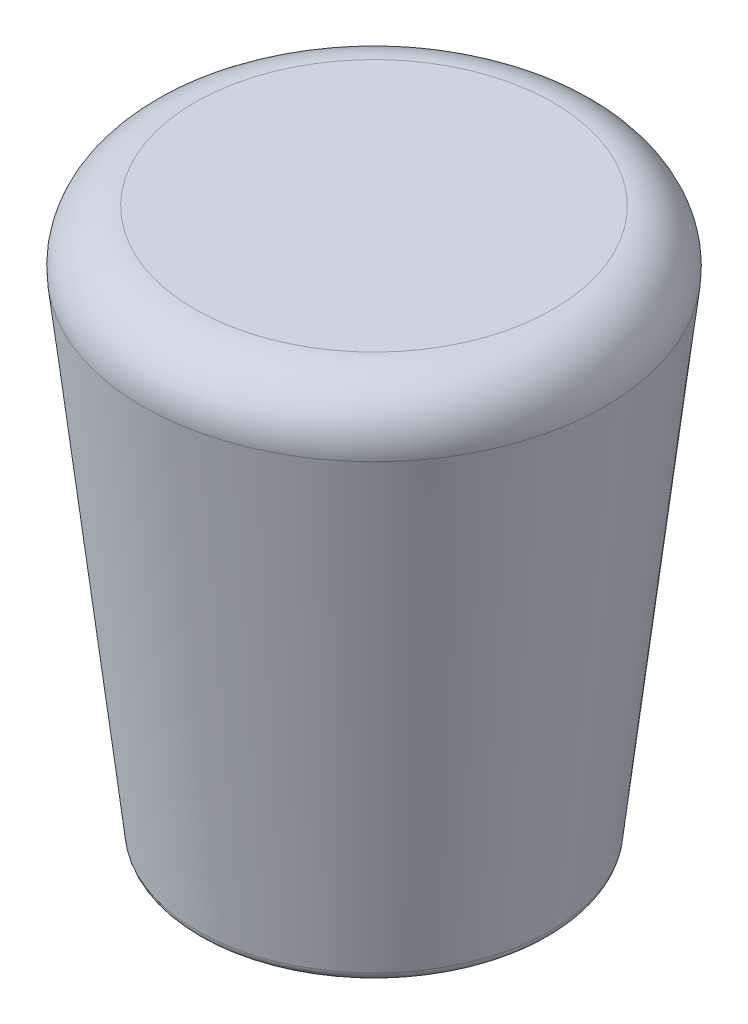
ISO-10303-21;
HEADER;
FILE_DESCRIPTION(('STEP AP214'),'2;1');
FILE_NAME('part.step','',(''),(''),'','','');
FILE_SCHEMA(('AUTOMOTIVE_DESIGN { 1 0 10303 214 1 1 1 1 }'));
ENDSEC;
DATA;
#1=APPLICATION_CONTEXT('core data for automotive mechanical design processes');
#2=APPLICATION_PROTOCOL_DEFINITION('international standard','automotive_design',2000,#1);
#3=PRODUCT_CONTEXT('',#1,'mechanical');
#4=PRODUCT('Part','Part','',(#3));
#5=PRODUCT_RELATED_PRODUCT_CATEGORY('part','',(#4));
#6=PRODUCT_DEFINITION_FORMATION('','',#4);
#7=PRODUCT_DEFINITION_CONTEXT('part definition',#1,'design');
#8=PRODUCT_DEFINITION('design','',#6,#7);
#9=PRODUCT_DEFINITION_SHAPE('','',#8);
#10=(LENGTH_UNIT() NAMED_UNIT(*) SI_UNIT(.MILLI.,.METRE.));
#11=(NAMED_UNIT(*) PLANE_ANGLE_UNIT() SI_UNIT($,.RADIAN.));
#12=(NAMED_UNIT(*) SI_UNIT($,.STERADIAN.) SOLID_ANGLE_UNIT());
#13=UNCERTAINTY_MEASURE_WITH_UNIT(LENGTH_MEASURE(1.E-05),#10,'distance_accuracy_value','');
#14=(GEOMETRIC_REPRESENTATION_CONTEXT(3) GLOBAL_UNCERTAINTY_ASSIGNED_CONTEXT((#13)) GLOBAL_UNIT_ASSIGNED_CONTEXT((#10,
#11,#12)) REPRESENTATION_CONTEXT('',''));
#15=CARTESIAN_POINT('',(0.,0.,0.));
#16=DIRECTION('',(0.,0.,1.));
#17=DIRECTION('',(1.,0.,0.));
#18=AXIS2_PLACEMENT_3D('',#15,#16,#17);
#19=CARTESIAN_POINT('',(0.,0.,0.));
#20=DIRECTION('',(0.,1.,0.));
#21=DIRECTION('',(0.,0.,1.));
#22=AXIS2_PLACEMENT_3D('',#19,#20,#21);
#23=CONICAL_SURFACE('',#22,3.35,0.113446401379632);
#24=CARTESIAN_POINT('',(0.,0.177359357246387,0.));
#25=DIRECTION('',(0.,-1.,0.));
#26=DIRECTION('',(0.,0.,-1.));
#27=AXIS2_PLACEMENT_3D('',#24,#25,#26);
#28=CIRCLE('',#27,3.37020754625586);
#29=CARTESIAN_POINT('',(0.,0.177359357246387,-3.37020754625586));
#30=VERTEX_POINT('',#29);
#31=EDGE_CURVE('E39',#30,#30,#28,.F.);
#32=ORIENTED_EDGE('',*,*,#31,.T.);
#33=EDGE_LOOP('',(#32));
#34=FACE_BOUND('',#33,.T.);
#35=CARTESIAN_POINT('',(0.,9.38679678623211,0.));
#36=DIRECTION('',(0.,1.,0.));
#37=DIRECTION('',(0.,0.,1.));
#38=AXIS2_PLACEMENT_3D('',#35,#36,#37);
#39=CIRCLE('',#38,4.41949040184329);
#40=CARTESIAN_POINT('',(0.,9.38679678623211,4.41949040184329));
#41=VERTEX_POINT('',#40);
#42=EDGE_CURVE('E43',#41,#41,#39,.F.);
#43=ORIENTED_EDGE('',*,*,#42,.T.);
#44=EDGE_LOOP('',(#43));
#45=FACE_BOUND('',#44,.T.);
#46=ADVANCED_FACE('F32',(#34,#45),#23,.T.);
#47=CARTESIAN_POINT('',(0.,10.5,0.));
#48=DIRECTION('',(0.,1.,0.));
#49=DIRECTION('',(0.,0.,1.));
#50=AXIS2_PLACEMENT_3D('',#47,#48,#49);
#51=PLANE('',#50);
#52=CARTESIAN_POINT('',(0.,10.5,0.));
#53=DIRECTION('',(0.,1.,0.));
#54=DIRECTION('',(0.,0.,1.));
#55=AXIS2_PLACEMENT_3D('',#52,#53,#54);
#56=CIRCLE('',#55,3.4259185461667);
#57=CARTESIAN_POINT('',(0.,10.5,3.4259185461667));
#58=VERTEX_POINT('',#57);
#59=EDGE_CURVE('E47',#58,#58,#56,.T.);
#60=ORIENTED_EDGE('',*,*,#59,.T.);
#61=EDGE_LOOP('',(#60));
#62=FACE_BOUND('',#61,.T.);
#63=ADVANCED_FACE('F69',(#62),#51,.T.);
#64=CARTESIAN_POINT('',(0.,0.,0.));
#65=DIRECTION('',(0.,1.,0.));
#66=DIRECTION('',(0.,0.,1.));
#67=AXIS2_PLACEMENT_3D('',#64,#65,#66);
#68=PLANE('',#67);
#69=CARTESIAN_POINT('',(0.,0.,0.));
#70=DIRECTION('',(0.,1.,0.));
#71=DIRECTION('',(0.,0.,1.));
#72=AXIS2_PLACEMENT_3D('',#69,#70,#71);
#73=CIRCLE('',#72,3.17149317512054);
#74=CARTESIAN_POINT('',(0.,0.,3.17149317512054));
#75=VERTEX_POINT('',#74);
#76=EDGE_CURVE('E10',#75,#75,#73,.F.);
#77=ORIENTED_EDGE('',*,*,#76,.T.);
#78=EDGE_LOOP('',(#77));
#79=FACE_BOUND('',#78,.T.);
#80=CARTESIAN_POINT('',(0.,0.,0.));
#81=DIRECTION('',(0.,-1.,0.));
#82=DIRECTION('',(0.,0.,-1.));
#83=AXIS2_PLACEMENT_3D('',#80,#81,#82);
#84=CIRCLE('',#83,3.);
#85=CARTESIAN_POINT('',(0.,0.,-3.));
#86=VERTEX_POINT('',#85);
#87=EDGE_CURVE('E53',#86,#86,#84,.T.);
#88=ORIENTED_EDGE('',*,*,#87,.F.);
#89=EDGE_LOOP('',(#88));
#90=FACE_BOUND('',#89,.T.);
#91=ADVANCED_FACE('F64',(#79,#90),#68,.F.);
#92=CARTESIAN_POINT('',(0.,9.00000000000001,0.));
#93=DIRECTION('',(0.,-1.,0.));
#94=DIRECTION('',(0.,0.,-1.));
#95=AXIS2_PLACEMENT_3D('',#92,#93,#94);
#96=CYLINDRICAL_SURFACE('',#95,3.);
#97=CARTESIAN_POINT('',(0.,9.00000000000001,0.));
#98=DIRECTION('',(0.,-1.,0.));
#99=DIRECTION('',(0.,0.,-1.));
#100=AXIS2_PLACEMENT_3D('',#97,#98,#99);
#101=CIRCLE('',#100,3.);
#102=CARTESIAN_POINT('',(0.,9.00000000000001,-3.));
#103=VERTEX_POINT('',#102);
#104=EDGE_CURVE('E52',#103,#103,#101,.T.);
#105=ORIENTED_EDGE('',*,*,#104,.F.);
#106=EDGE_LOOP('',(#105));
#107=FACE_BOUND('',#106,.T.);
#108=ORIENTED_EDGE('',*,*,#87,.T.);
#109=EDGE_LOOP('',(#108));
#110=FACE_BOUND('',#109,.T.);
#111=ADVANCED_FACE('F61',(#107,#110),#96,.F.);
#112=CARTESIAN_POINT('',(0.,9.00000000000001,0.));
#113=DIRECTION('',(0.,-1.,0.));
#114=DIRECTION('',(0.,0.,-1.));
#115=AXIS2_PLACEMENT_3D('',#112,#113,#114);
#116=PLANE('',#115);
#117=ORIENTED_EDGE('',*,*,#104,.T.);
#118=EDGE_LOOP('',(#117));
#119=FACE_BOUND('',#118,.T.);
#120=ADVANCED_FACE('F59',(#119),#116,.T.);
#121=CARTESIAN_POINT('',(0.,9.49999999999995,0.));
#122=DIRECTION('',(0.,1.,0.));
#123=DIRECTION('',(0.,0.,1.));
#124=AXIS2_PLACEMENT_3D('',#121,#122,#123);
#125=TOROIDAL_SURFACE('',#124,3.4259185461667,1.);
#126=ORIENTED_EDGE('',*,*,#42,.F.);
#127=EDGE_LOOP('',(#126));
#128=FACE_BOUND('',#127,.T.);
#129=ORIENTED_EDGE('',*,*,#59,.F.);
#130=EDGE_LOOP('',(#129));
#131=FACE_BOUND('',#130,.T.);
#132=ADVANCED_FACE('F81',(#128,#131),#125,.T.);
#133=CARTESIAN_POINT('',(0.,0.199999999999978,0.));
#134=DIRECTION('',(0.,1.,0.));
#135=DIRECTION('',(0.,0.,1.));
#136=AXIS2_PLACEMENT_3D('',#133,#134,#135);
#137=TOROIDAL_SURFACE('',#136,3.17149317512054,0.2);
#138=ORIENTED_EDGE('',*,*,#76,.F.);
#139=EDGE_LOOP('',(#138));
#140=FACE_BOUND('',#139,.T.);
#141=ORIENTED_EDGE('',*,*,#31,.F.);
#142=EDGE_LOOP('',(#141));
#143=FACE_BOUND('',#142,.T.);
#144=ADVANCED_FACE('F34',(#140,#143),#137,.T.);
#145=CLOSED_SHELL('',(#46,#63,#91,#111,#120,#132,#144));
#146=MANIFOLD_SOLID_BREP('B2',#145);
#147=ADVANCED_BREP_SHAPE_REPRESENTATION('',(#18,#146),#14);
#148=SHAPE_DEFINITION_REPRESENTATION(#9,#147);
ENDSEC;
END-ISO-10303-21;
